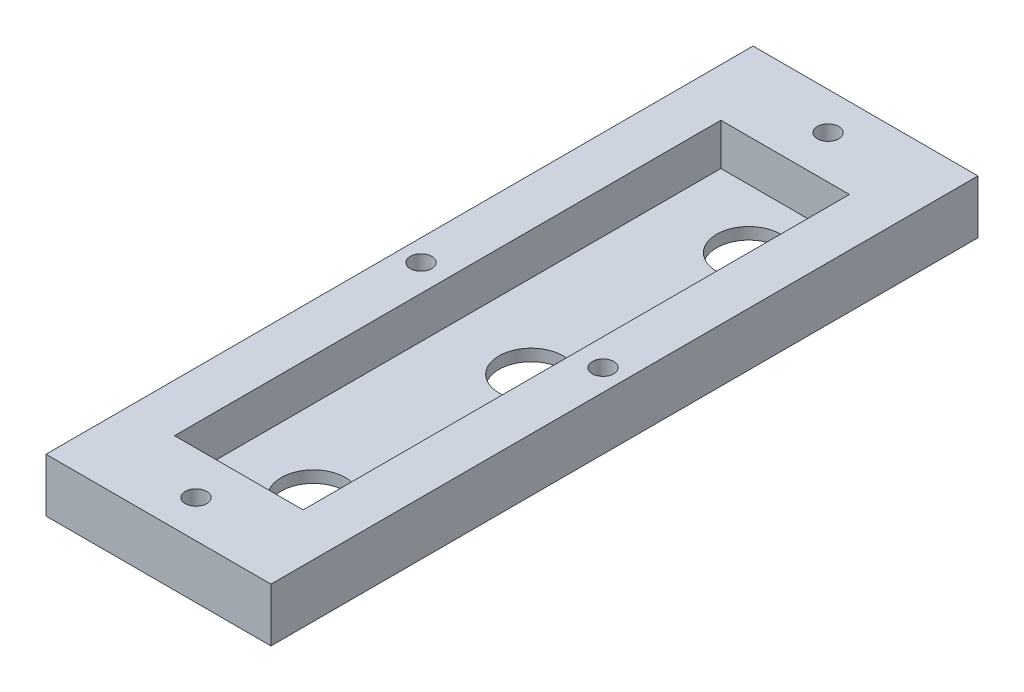
ISO-10303-21;
HEADER;
FILE_DESCRIPTION(('STEP AP214'),'2;1');
FILE_NAME('part.step','',(''),(''),'','','');
FILE_SCHEMA(('AUTOMOTIVE_DESIGN { 1 0 10303 214 1 1 1 1 }'));
ENDSEC;
DATA;
#1=APPLICATION_CONTEXT('core data for automotive mechanical design processes');
#2=APPLICATION_PROTOCOL_DEFINITION('international standard','automotive_design',2000,#1);
#3=PRODUCT_CONTEXT('',#1,'mechanical');
#4=PRODUCT('Part','Part','',(#3));
#5=PRODUCT_RELATED_PRODUCT_CATEGORY('part','',(#4));
#6=PRODUCT_DEFINITION_FORMATION('','',#4);
#7=PRODUCT_DEFINITION_CONTEXT('part definition',#1,'design');
#8=PRODUCT_DEFINITION('design','',#6,#7);
#9=PRODUCT_DEFINITION_SHAPE('','',#8);
#10=(LENGTH_UNIT() NAMED_UNIT(*) SI_UNIT(.MILLI.,.METRE.));
#11=(NAMED_UNIT(*) PLANE_ANGLE_UNIT() SI_UNIT($,.RADIAN.));
#12=(NAMED_UNIT(*) SI_UNIT($,.STERADIAN.) SOLID_ANGLE_UNIT());
#13=UNCERTAINTY_MEASURE_WITH_UNIT(LENGTH_MEASURE(1.E-05),#10,'distance_accuracy_value','');
#14=(GEOMETRIC_REPRESENTATION_CONTEXT(3) GLOBAL_UNCERTAINTY_ASSIGNED_CONTEXT((#13)) GLOBAL_UNIT_ASSIGNED_CONTEXT((#10,
#11,#12)) REPRESENTATION_CONTEXT('',''));
#15=CARTESIAN_POINT('',(0.,0.,0.));
#16=DIRECTION('',(0.,0.,1.));
#17=DIRECTION('',(1.,0.,0.));
#18=AXIS2_PLACEMENT_3D('',#15,#16,#17);
#19=CARTESIAN_POINT('',(0.,1.1,0.));
#20=DIRECTION('',(0.,-1.,0.));
#21=DIRECTION('',(0.,0.,-1.));
#22=AXIS2_PLACEMENT_3D('',#19,#20,#21);
#23=PLANE('',#22);
#24=CARTESIAN_POINT('',(2.11381085387861,1.1,-19.9912830124895));
#25=DIRECTION('',(0.,-1.,0.));
#26=DIRECTION('',(0.,0.,-1.));
#27=AXIS2_PLACEMENT_3D('',#24,#25,#26);
#28=CIRCLE('',#27,3.);
#29=CARTESIAN_POINT('',(2.11381085387861,1.1,-22.9912830124895));
#30=VERTEX_POINT('',#29);
#31=EDGE_CURVE('E168',#30,#30,#28,.T.);
#32=ORIENTED_EDGE('',*,*,#31,.T.);
#33=EDGE_LOOP('',(#32));
#34=FACE_BOUND('',#33,.T.);
#35=CARTESIAN_POINT('',(1.78606829592522,1.1,0.00603142759754427));
#36=DIRECTION('',(0.,-1.,0.));
#37=DIRECTION('',(0.,0.,-1.));
#38=AXIS2_PLACEMENT_3D('',#35,#36,#37);
#39=CIRCLE('',#38,3.);
#40=CARTESIAN_POINT('',(1.78606829592522,1.1,-2.99396857240246));
#41=VERTEX_POINT('',#40);
#42=EDGE_CURVE('E179',#41,#41,#39,.T.);
#43=ORIENTED_EDGE('',*,*,#42,.T.);
#44=EDGE_LOOP('',(#43));
#45=FACE_BOUND('',#44,.T.);
#46=CARTESIAN_POINT('',(1.45832573797182,1.1,20.0033458676846));
#47=DIRECTION('',(0.,-1.,0.));
#48=DIRECTION('',(0.,0.,-1.));
#49=AXIS2_PLACEMENT_3D('',#46,#47,#48);
#50=CIRCLE('',#49,3.);
#51=CARTESIAN_POINT('',(1.45832573797182,1.1,17.0033458676846));
#52=VERTEX_POINT('',#51);
#53=EDGE_CURVE('E169',#52,#52,#50,.T.);
#54=ORIENTED_EDGE('',*,*,#53,.T.);
#55=EDGE_LOOP('',(#54));
#56=FACE_BOUND('',#55,.T.);
#57=DIRECTION('',(1.,0.,0.));
#58=VECTOR('',#57,1.);
#59=CARTESIAN_POINT('',(0.,1.1,-25.5));
#60=LINE('',#59,#58);
#61=CARTESIAN_POINT('',(-6.00000000000001,1.1,-25.5));
#62=VERTEX_POINT('',#61);
#63=CARTESIAN_POINT('',(6.,1.1,-25.5));
#64=VERTEX_POINT('',#63);
#65=EDGE_CURVE('E58',#62,#64,#60,.T.);
#66=ORIENTED_EDGE('',*,*,#65,.F.);
#67=DIRECTION('',(0.,0.,1.));
#68=VECTOR('',#67,1.);
#69=CARTESIAN_POINT('',(-6.00000000000001,1.1,0.));
#70=LINE('',#69,#68);
#71=CARTESIAN_POINT('',(-6.00000000000001,1.1,25.5));
#72=VERTEX_POINT('',#71);
#73=EDGE_CURVE('E63',#62,#72,#70,.T.);
#74=ORIENTED_EDGE('',*,*,#73,.T.);
#75=DIRECTION('',(1.,0.,0.));
#76=VECTOR('',#75,1.);
#77=CARTESIAN_POINT('',(0.,1.1,25.5));
#78=LINE('',#77,#76);
#79=CARTESIAN_POINT('',(6.,1.1,25.5));
#80=VERTEX_POINT('',#79);
#81=EDGE_CURVE('E133',#72,#80,#78,.T.);
#82=ORIENTED_EDGE('',*,*,#81,.T.);
#83=DIRECTION('',(0.,0.,1.));
#84=VECTOR('',#83,1.);
#85=CARTESIAN_POINT('',(6.,1.1,0.));
#86=LINE('',#85,#84);
#87=EDGE_CURVE('E154',#64,#80,#86,.T.);
#88=ORIENTED_EDGE('',*,*,#87,.F.);
#89=EDGE_LOOP('',(#66,#74,#82,#88));
#90=FACE_BOUND('',#89,.T.);
#91=ADVANCED_FACE('F43',(#34,#45,#56,#90),#23,.F.);
#92=CARTESIAN_POINT('',(10.5,1.1,33.));
#93=DIRECTION('',(-1.,0.,0.));
#94=DIRECTION('',(0.,0.,1.));
#95=AXIS2_PLACEMENT_3D('',#92,#93,#94);
#96=PLANE('',#95);
#97=DIRECTION('',(0.,0.,-1.));
#98=VECTOR('',#97,1.);
#99=CARTESIAN_POINT('',(10.5,0.,33.));
#100=LINE('',#99,#98);
#101=CARTESIAN_POINT('',(10.5,0.,33.));
#102=VERTEX_POINT('',#101);
#103=CARTESIAN_POINT('',(10.5,0.,-33.));
#104=VERTEX_POINT('',#103);
#105=EDGE_CURVE('E172',#102,#104,#100,.T.);
#106=ORIENTED_EDGE('',*,*,#105,.T.);
#107=DIRECTION('',(0.,-1.,0.));
#108=VECTOR('',#107,1.);
#109=CARTESIAN_POINT('',(10.5,1.1,-33.));
#110=LINE('',#109,#108);
#111=CARTESIAN_POINT('',(10.5,5.,-33.));
#112=VERTEX_POINT('',#111);
#113=EDGE_CURVE('E12',#112,#104,#110,.T.);
#114=ORIENTED_EDGE('',*,*,#113,.F.);
#115=DIRECTION('',(0.,0.,-1.));
#116=VECTOR('',#115,1.);
#117=CARTESIAN_POINT('',(10.5,5.,0.));
#118=LINE('',#117,#116);
#119=CARTESIAN_POINT('',(10.5,5.,33.));
#120=VERTEX_POINT('',#119);
#121=EDGE_CURVE('E121',#120,#112,#118,.T.);
#122=ORIENTED_EDGE('',*,*,#121,.F.);
#123=DIRECTION('',(0.,-1.,0.));
#124=VECTOR('',#123,1.);
#125=CARTESIAN_POINT('',(10.5,1.1,33.));
#126=LINE('',#125,#124);
#127=EDGE_CURVE('E107',#120,#102,#126,.T.);
#128=ORIENTED_EDGE('',*,*,#127,.T.);
#129=EDGE_LOOP('',(#106,#114,#122,#128));
#130=FACE_BOUND('',#129,.T.);
#131=ADVANCED_FACE('F45',(#130),#96,.F.);
#132=CARTESIAN_POINT('',(-10.5,1.1,-33.));
#133=DIRECTION('',(0.,0.,1.));
#134=DIRECTION('',(1.,0.,0.));
#135=AXIS2_PLACEMENT_3D('',#132,#133,#134);
#136=PLANE('',#135);
#137=DIRECTION('',(-1.,0.,0.));
#138=VECTOR('',#137,1.);
#139=CARTESIAN_POINT('',(-10.5,0.,-33.));
#140=LINE('',#139,#138);
#141=CARTESIAN_POINT('',(-10.5,0.,-33.));
#142=VERTEX_POINT('',#141);
#143=EDGE_CURVE('E188',#104,#142,#140,.T.);
#144=ORIENTED_EDGE('',*,*,#143,.T.);
#145=DIRECTION('',(0.,-1.,0.));
#146=VECTOR('',#145,1.);
#147=CARTESIAN_POINT('',(-10.5,1.1,-33.));
#148=LINE('',#147,#146);
#149=CARTESIAN_POINT('',(-10.5,5.,-33.));
#150=VERTEX_POINT('',#149);
#151=EDGE_CURVE('E51',#150,#142,#148,.T.);
#152=ORIENTED_EDGE('',*,*,#151,.F.);
#153=DIRECTION('',(-1.,0.,0.));
#154=VECTOR('',#153,1.);
#155=CARTESIAN_POINT('',(0.,5.,-33.));
#156=LINE('',#155,#154);
#157=EDGE_CURVE('E125',#112,#150,#156,.T.);
#158=ORIENTED_EDGE('',*,*,#157,.F.);
#159=ORIENTED_EDGE('',*,*,#113,.T.);
#160=EDGE_LOOP('',(#144,#152,#158,#159));
#161=FACE_BOUND('',#160,.T.);
#162=ADVANCED_FACE('F200',(#161),#136,.F.);
#163=CARTESIAN_POINT('',(-10.5,1.1,33.));
#164=DIRECTION('',(1.,0.,0.));
#165=DIRECTION('',(0.,0.,-1.));
#166=AXIS2_PLACEMENT_3D('',#163,#164,#165);
#167=PLANE('',#166);
#168=DIRECTION('',(0.,0.,1.));
#169=VECTOR('',#168,1.);
#170=CARTESIAN_POINT('',(-10.5,0.,33.));
#171=LINE('',#170,#169);
#172=CARTESIAN_POINT('',(-10.5,0.,33.));
#173=VERTEX_POINT('',#172);
#174=EDGE_CURVE('E190',#142,#173,#171,.T.);
#175=ORIENTED_EDGE('',*,*,#174,.T.);
#176=DIRECTION('',(0.,-1.,0.));
#177=VECTOR('',#176,1.);
#178=CARTESIAN_POINT('',(-10.5,1.1,33.));
#179=LINE('',#178,#177);
#180=CARTESIAN_POINT('',(-10.5,5.,33.));
#181=VERTEX_POINT('',#180);
#182=EDGE_CURVE('E118',#181,#173,#179,.T.);
#183=ORIENTED_EDGE('',*,*,#182,.F.);
#184=DIRECTION('',(0.,0.,1.));
#185=VECTOR('',#184,1.);
#186=CARTESIAN_POINT('',(-10.5,5.,0.));
#187=LINE('',#186,#185);
#188=EDGE_CURVE('E131',#150,#181,#187,.T.);
#189=ORIENTED_EDGE('',*,*,#188,.F.);
#190=ORIENTED_EDGE('',*,*,#151,.T.);
#191=EDGE_LOOP('',(#175,#183,#189,#190));
#192=FACE_BOUND('',#191,.T.);
#193=ADVANCED_FACE('F196',(#192),#167,.F.);
#194=CARTESIAN_POINT('',(-10.5,1.1,33.));
#195=DIRECTION('',(0.,0.,-1.));
#196=DIRECTION('',(-1.,0.,0.));
#197=AXIS2_PLACEMENT_3D('',#194,#195,#196);
#198=PLANE('',#197);
#199=DIRECTION('',(1.,0.,0.));
#200=VECTOR('',#199,1.);
#201=CARTESIAN_POINT('',(-10.5,0.,33.));
#202=LINE('',#201,#200);
#203=EDGE_CURVE('E114',#173,#102,#202,.T.);
#204=ORIENTED_EDGE('',*,*,#203,.T.);
#205=ORIENTED_EDGE('',*,*,#127,.F.);
#206=DIRECTION('',(1.,0.,0.));
#207=VECTOR('',#206,1.);
#208=CARTESIAN_POINT('',(0.,5.,33.));
#209=LINE('',#208,#207);
#210=EDGE_CURVE('E112',#181,#120,#209,.T.);
#211=ORIENTED_EDGE('',*,*,#210,.F.);
#212=ORIENTED_EDGE('',*,*,#182,.T.);
#213=EDGE_LOOP('',(#204,#205,#211,#212));
#214=FACE_BOUND('',#213,.T.);
#215=ADVANCED_FACE('F109',(#214),#198,.F.);
#216=CARTESIAN_POINT('',(0.,0.,0.));
#217=DIRECTION('',(0.,-1.,0.));
#218=DIRECTION('',(0.,0.,-1.));
#219=AXIS2_PLACEMENT_3D('',#216,#217,#218);
#220=PLANE('',#219);
#221=CARTESIAN_POINT('',(0.,0.,29.5));
#222=DIRECTION('',(0.,-1.,0.));
#223=DIRECTION('',(0.,0.,-1.));
#224=AXIS2_PLACEMENT_3D('',#221,#222,#223);
#225=CIRCLE('',#224,1.9);
#226=CARTESIAN_POINT('',(0.,0.,27.6));
#227=VERTEX_POINT('',#226);
#228=EDGE_CURVE('E155',#227,#227,#225,.T.);
#229=ORIENTED_EDGE('',*,*,#228,.F.);
#230=EDGE_LOOP('',(#229));
#231=FACE_BOUND('',#230,.T.);
#232=CARTESIAN_POINT('',(-8.50000000000001,0.,0.));
#233=DIRECTION('',(0.,-1.,0.));
#234=DIRECTION('',(0.,0.,-1.));
#235=AXIS2_PLACEMENT_3D('',#232,#233,#234);
#236=CIRCLE('',#235,1.9);
#237=CARTESIAN_POINT('',(-8.50000000000001,0.,-1.89999999999999));
#238=VERTEX_POINT('',#237);
#239=EDGE_CURVE('E551',#238,#238,#236,.T.);
#240=ORIENTED_EDGE('',*,*,#239,.F.);
#241=EDGE_LOOP('',(#240));
#242=FACE_BOUND('',#241,.T.);
#243=CARTESIAN_POINT('',(8.50000000000001,0.,0.));
#244=DIRECTION('',(0.,-1.,0.));
#245=DIRECTION('',(0.,0.,-1.));
#246=AXIS2_PLACEMENT_3D('',#243,#244,#245);
#247=CIRCLE('',#246,1.9);
#248=CARTESIAN_POINT('',(8.50000000000001,0.,-1.89999999999999));
#249=VERTEX_POINT('',#248);
#250=EDGE_CURVE('E557',#249,#249,#247,.T.);
#251=ORIENTED_EDGE('',*,*,#250,.F.);
#252=EDGE_LOOP('',(#251));
#253=FACE_BOUND('',#252,.T.);
#254=CARTESIAN_POINT('',(0.,0.,-29.5));
#255=DIRECTION('',(0.,-1.,0.));
#256=DIRECTION('',(0.,0.,-1.));
#257=AXIS2_PLACEMENT_3D('',#254,#255,#256);
#258=CIRCLE('',#257,1.9);
#259=CARTESIAN_POINT('',(0.,0.,-31.4));
#260=VERTEX_POINT('',#259);
#261=EDGE_CURVE('E136',#260,#260,#258,.T.);
#262=ORIENTED_EDGE('',*,*,#261,.F.);
#263=EDGE_LOOP('',(#262));
#264=FACE_BOUND('',#263,.T.);
#265=CARTESIAN_POINT('',(1.45832573797182,0.,20.0033458676846));
#266=DIRECTION('',(0.,-1.,0.));
#267=DIRECTION('',(0.,0.,-1.));
#268=AXIS2_PLACEMENT_3D('',#265,#266,#267);
#269=CIRCLE('',#268,3.);
#270=CARTESIAN_POINT('',(1.45832573797182,0.,17.0033458676846));
#271=VERTEX_POINT('',#270);
#272=EDGE_CURVE('E173',#271,#271,#269,.T.);
#273=ORIENTED_EDGE('',*,*,#272,.F.);
#274=EDGE_LOOP('',(#273));
#275=FACE_BOUND('',#274,.T.);
#276=CARTESIAN_POINT('',(1.78606829592522,0.,0.00603142759754427));
#277=DIRECTION('',(0.,-1.,0.));
#278=DIRECTION('',(0.,0.,-1.));
#279=AXIS2_PLACEMENT_3D('',#276,#277,#278);
#280=CIRCLE('',#279,3.);
#281=CARTESIAN_POINT('',(1.78606829592522,0.,-2.99396857240246));
#282=VERTEX_POINT('',#281);
#283=EDGE_CURVE('E176',#282,#282,#280,.T.);
#284=ORIENTED_EDGE('',*,*,#283,.F.);
#285=EDGE_LOOP('',(#284));
#286=FACE_BOUND('',#285,.T.);
#287=CARTESIAN_POINT('',(2.11381085387861,0.,-19.9912830124895));
#288=DIRECTION('',(0.,-1.,0.));
#289=DIRECTION('',(0.,0.,-1.));
#290=AXIS2_PLACEMENT_3D('',#287,#288,#289);
#291=CIRCLE('',#290,3.);
#292=CARTESIAN_POINT('',(2.11381085387861,0.,-22.9912830124895));
#293=VERTEX_POINT('',#292);
#294=EDGE_CURVE('E182',#293,#293,#291,.T.);
#295=ORIENTED_EDGE('',*,*,#294,.F.);
#296=EDGE_LOOP('',(#295));
#297=FACE_BOUND('',#296,.T.);
#298=ORIENTED_EDGE('',*,*,#105,.F.);
#299=ORIENTED_EDGE('',*,*,#203,.F.);
#300=ORIENTED_EDGE('',*,*,#174,.F.);
#301=ORIENTED_EDGE('',*,*,#143,.F.);
#302=EDGE_LOOP('',(#298,#299,#300,#301));
#303=FACE_BOUND('',#302,.T.);
#304=ADVANCED_FACE('F199',(#231,#242,#253,#264,#275,#286,#297,#303),#220,.T.);
#305=CARTESIAN_POINT('',(2.11381085387861,1.1,-19.9912830124895));
#306=DIRECTION('',(0.,-1.,0.));
#307=DIRECTION('',(0.,0.,-1.));
#308=AXIS2_PLACEMENT_3D('',#305,#306,#307);
#309=CYLINDRICAL_SURFACE('',#308,3.);
#310=ORIENTED_EDGE('',*,*,#31,.F.);
#311=EDGE_LOOP('',(#310));
#312=FACE_BOUND('',#311,.T.);
#313=ORIENTED_EDGE('',*,*,#294,.T.);
#314=EDGE_LOOP('',(#313));
#315=FACE_BOUND('',#314,.T.);
#316=ADVANCED_FACE('F217',(#312,#315),#309,.F.);
#317=CARTESIAN_POINT('',(1.78606829592522,1.1,0.00603142759754427));
#318=DIRECTION('',(0.,-1.,0.));
#319=DIRECTION('',(0.,0.,-1.));
#320=AXIS2_PLACEMENT_3D('',#317,#318,#319);
#321=CYLINDRICAL_SURFACE('',#320,3.);
#322=ORIENTED_EDGE('',*,*,#42,.F.);
#323=EDGE_LOOP('',(#322));
#324=FACE_BOUND('',#323,.T.);
#325=ORIENTED_EDGE('',*,*,#283,.T.);
#326=EDGE_LOOP('',(#325));
#327=FACE_BOUND('',#326,.T.);
#328=ADVANCED_FACE('F444',(#324,#327),#321,.F.);
#329=CARTESIAN_POINT('',(1.45832573797182,1.1,20.0033458676846));
#330=DIRECTION('',(0.,-1.,0.));
#331=DIRECTION('',(0.,0.,-1.));
#332=AXIS2_PLACEMENT_3D('',#329,#330,#331);
#333=CYLINDRICAL_SURFACE('',#332,3.);
#334=ORIENTED_EDGE('',*,*,#53,.F.);
#335=EDGE_LOOP('',(#334));
#336=FACE_BOUND('',#335,.T.);
#337=ORIENTED_EDGE('',*,*,#272,.T.);
#338=EDGE_LOOP('',(#337));
#339=FACE_BOUND('',#338,.T.);
#340=ADVANCED_FACE('F235',(#336,#339),#333,.F.);
#341=CARTESIAN_POINT('',(0.,5.,-25.5));
#342=DIRECTION('',(0.,0.,-1.));
#343=DIRECTION('',(-1.,0.,0.));
#344=AXIS2_PLACEMENT_3D('',#341,#342,#343);
#345=PLANE('',#344);
#346=ORIENTED_EDGE('',*,*,#65,.T.);
#347=DIRECTION('',(0.,-1.,0.));
#348=VECTOR('',#347,1.);
#349=CARTESIAN_POINT('',(6.,5.,-25.5));
#350=LINE('',#349,#348);
#351=CARTESIAN_POINT('',(6.,5.,-25.5));
#352=VERTEX_POINT('',#351);
#353=EDGE_CURVE('E165',#352,#64,#350,.T.);
#354=ORIENTED_EDGE('',*,*,#353,.F.);
#355=DIRECTION('',(1.,0.,0.));
#356=VECTOR('',#355,1.);
#357=CARTESIAN_POINT('',(0.,5.,-25.5));
#358=LINE('',#357,#356);
#359=CARTESIAN_POINT('',(-6.00000000000001,5.,-25.5));
#360=VERTEX_POINT('',#359);
#361=EDGE_CURVE('E141',#360,#352,#358,.T.);
#362=ORIENTED_EDGE('',*,*,#361,.F.);
#363=DIRECTION('',(0.,-1.,0.));
#364=VECTOR('',#363,1.);
#365=CARTESIAN_POINT('',(-6.00000000000001,5.,-25.5));
#366=LINE('',#365,#364);
#367=EDGE_CURVE('E152',#360,#62,#366,.T.);
#368=ORIENTED_EDGE('',*,*,#367,.T.);
#369=EDGE_LOOP('',(#346,#354,#362,#368));
#370=FACE_BOUND('',#369,.T.);
#371=ADVANCED_FACE('F231',(#370),#345,.F.);
#372=CARTESIAN_POINT('',(6.,5.,0.));
#373=DIRECTION('',(1.,0.,0.));
#374=DIRECTION('',(0.,0.,-1.));
#375=AXIS2_PLACEMENT_3D('',#372,#373,#374);
#376=PLANE('',#375);
#377=ORIENTED_EDGE('',*,*,#87,.T.);
#378=DIRECTION('',(0.,-1.,0.));
#379=VECTOR('',#378,1.);
#380=CARTESIAN_POINT('',(6.,5.,25.5));
#381=LINE('',#380,#379);
#382=CARTESIAN_POINT('',(6.,5.,25.5));
#383=VERTEX_POINT('',#382);
#384=EDGE_CURVE('E162',#383,#80,#381,.T.);
#385=ORIENTED_EDGE('',*,*,#384,.F.);
#386=DIRECTION('',(0.,0.,1.));
#387=VECTOR('',#386,1.);
#388=CARTESIAN_POINT('',(6.,5.,0.));
#389=LINE('',#388,#387);
#390=EDGE_CURVE('E144',#352,#383,#389,.T.);
#391=ORIENTED_EDGE('',*,*,#390,.F.);
#392=ORIENTED_EDGE('',*,*,#353,.T.);
#393=EDGE_LOOP('',(#377,#385,#391,#392));
#394=FACE_BOUND('',#393,.T.);
#395=ADVANCED_FACE('F234',(#394),#376,.F.);
#396=CARTESIAN_POINT('',(0.,5.,25.5));
#397=DIRECTION('',(0.,0.,-1.));
#398=DIRECTION('',(-1.,0.,0.));
#399=AXIS2_PLACEMENT_3D('',#396,#397,#398);
#400=PLANE('',#399);
#401=ORIENTED_EDGE('',*,*,#81,.F.);
#402=DIRECTION('',(0.,-1.,0.));
#403=VECTOR('',#402,1.);
#404=CARTESIAN_POINT('',(-6.00000000000001,5.,25.5));
#405=LINE('',#404,#403);
#406=CARTESIAN_POINT('',(-6.00000000000001,5.,25.5));
#407=VERTEX_POINT('',#406);
#408=EDGE_CURVE('E160',#407,#72,#405,.T.);
#409=ORIENTED_EDGE('',*,*,#408,.F.);
#410=DIRECTION('',(1.,0.,0.));
#411=VECTOR('',#410,1.);
#412=CARTESIAN_POINT('',(0.,5.,25.5));
#413=LINE('',#412,#411);
#414=EDGE_CURVE('E146',#407,#383,#413,.T.);
#415=ORIENTED_EDGE('',*,*,#414,.T.);
#416=ORIENTED_EDGE('',*,*,#384,.T.);
#417=EDGE_LOOP('',(#401,#409,#415,#416));
#418=FACE_BOUND('',#417,.T.);
#419=ADVANCED_FACE('F243',(#418),#400,.T.);
#420=CARTESIAN_POINT('',(-6.00000000000001,5.,0.));
#421=DIRECTION('',(1.,0.,0.));
#422=DIRECTION('',(0.,0.,-1.));
#423=AXIS2_PLACEMENT_3D('',#420,#421,#422);
#424=PLANE('',#423);
#425=ORIENTED_EDGE('',*,*,#73,.F.);
#426=ORIENTED_EDGE('',*,*,#367,.F.);
#427=DIRECTION('',(0.,0.,1.));
#428=VECTOR('',#427,1.);
#429=CARTESIAN_POINT('',(-6.00000000000001,5.,0.));
#430=LINE('',#429,#428);
#431=EDGE_CURVE('E149',#360,#407,#430,.T.);
#432=ORIENTED_EDGE('',*,*,#431,.T.);
#433=ORIENTED_EDGE('',*,*,#408,.T.);
#434=EDGE_LOOP('',(#425,#426,#432,#433));
#435=FACE_BOUND('',#434,.T.);
#436=ADVANCED_FACE('F251',(#435),#424,.T.);
#437=CARTESIAN_POINT('',(0.,5.,0.));
#438=DIRECTION('',(0.,1.,0.));
#439=DIRECTION('',(0.,0.,1.));
#440=AXIS2_PLACEMENT_3D('',#437,#438,#439);
#441=PLANE('',#440);
#442=CARTESIAN_POINT('',(-8.50000000000001,5.,0.));
#443=DIRECTION('',(0.,-1.,0.));
#444=DIRECTION('',(0.,0.,-1.));
#445=AXIS2_PLACEMENT_3D('',#442,#443,#444);
#446=CIRCLE('',#445,1.);
#447=CARTESIAN_POINT('',(-8.50000000000001,5.,-0.999999999999986));
#448=VERTEX_POINT('',#447);
#449=EDGE_CURVE('E581',#448,#448,#446,.T.);
#450=ORIENTED_EDGE('',*,*,#449,.T.);
#451=EDGE_LOOP('',(#450));
#452=FACE_BOUND('',#451,.T.);
#453=CARTESIAN_POINT('',(8.50000000000001,5.,0.));
#454=DIRECTION('',(0.,-1.,0.));
#455=DIRECTION('',(0.,0.,-1.));
#456=AXIS2_PLACEMENT_3D('',#453,#454,#455);
#457=CIRCLE('',#456,1.);
#458=CARTESIAN_POINT('',(8.50000000000001,5.,-0.999999999999993));
#459=VERTEX_POINT('',#458);
#460=EDGE_CURVE('E588',#459,#459,#457,.T.);
#461=ORIENTED_EDGE('',*,*,#460,.T.);
#462=EDGE_LOOP('',(#461));
#463=FACE_BOUND('',#462,.T.);
#464=CARTESIAN_POINT('',(0.,5.,29.5));
#465=DIRECTION('',(0.,-1.,0.));
#466=DIRECTION('',(0.,0.,-1.));
#467=AXIS2_PLACEMENT_3D('',#464,#465,#466);
#468=CIRCLE('',#467,1.);
#469=CARTESIAN_POINT('',(0.,5.,28.5));
#470=VERTEX_POINT('',#469);
#471=EDGE_CURVE('E585',#470,#470,#468,.T.);
#472=ORIENTED_EDGE('',*,*,#471,.T.);
#473=EDGE_LOOP('',(#472));
#474=FACE_BOUND('',#473,.T.);
#475=CARTESIAN_POINT('',(0.,5.,-29.5));
#476=DIRECTION('',(0.,-1.,0.));
#477=DIRECTION('',(0.,0.,-1.));
#478=AXIS2_PLACEMENT_3D('',#475,#476,#477);
#479=CIRCLE('',#478,1.);
#480=CARTESIAN_POINT('',(0.,5.,-30.5));
#481=VERTEX_POINT('',#480);
#482=EDGE_CURVE('E529',#481,#481,#479,.T.);
#483=ORIENTED_EDGE('',*,*,#482,.T.);
#484=EDGE_LOOP('',(#483));
#485=FACE_BOUND('',#484,.T.);
#486=ORIENTED_EDGE('',*,*,#210,.T.);
#487=ORIENTED_EDGE('',*,*,#121,.T.);
#488=ORIENTED_EDGE('',*,*,#157,.T.);
#489=ORIENTED_EDGE('',*,*,#188,.T.);
#490=EDGE_LOOP('',(#486,#487,#488,#489));
#491=FACE_BOUND('',#490,.T.);
#492=ORIENTED_EDGE('',*,*,#361,.T.);
#493=ORIENTED_EDGE('',*,*,#390,.T.);
#494=ORIENTED_EDGE('',*,*,#414,.F.);
#495=ORIENTED_EDGE('',*,*,#431,.F.);
#496=EDGE_LOOP('',(#492,#493,#494,#495));
#497=FACE_BOUND('',#496,.T.);
#498=ADVANCED_FACE('F128',(#452,#463,#474,#485,#491,#497),#441,.T.);
#499=CARTESIAN_POINT('',(0.,10.3740115370178,-29.5));
#500=DIRECTION('',(0.,-1.,0.));
#501=DIRECTION('',(0.,0.,-1.));
#502=AXIS2_PLACEMENT_3D('',#499,#500,#501);
#503=CYLINDRICAL_SURFACE('',#502,1.9);
#504=ORIENTED_EDGE('',*,*,#261,.T.);
#505=EDGE_LOOP('',(#504));
#506=FACE_BOUND('',#505,.T.);
#507=CARTESIAN_POINT('',(0.,3.,-29.5));
#508=DIRECTION('',(0.,1.,0.));
#509=DIRECTION('',(0.,0.,1.));
#510=AXIS2_PLACEMENT_3D('',#507,#508,#509);
#511=CIRCLE('',#510,1.9);
#512=CARTESIAN_POINT('',(0.,3.,-27.6));
#513=VERTEX_POINT('',#512);
#514=EDGE_CURVE('E537',#513,#513,#511,.F.);
#515=ORIENTED_EDGE('',*,*,#514,.F.);
#516=EDGE_LOOP('',(#515));
#517=FACE_BOUND('',#516,.T.);
#518=ADVANCED_FACE('F267',(#506,#517),#503,.F.);
#519=CARTESIAN_POINT('',(0.,3.,0.));
#520=DIRECTION('',(0.,1.,0.));
#521=DIRECTION('',(0.,0.,1.));
#522=AXIS2_PLACEMENT_3D('',#519,#520,#521);
#523=PLANE('',#522);
#524=ORIENTED_EDGE('',*,*,#514,.T.);
#525=EDGE_LOOP('',(#524));
#526=FACE_BOUND('',#525,.T.);
#527=CARTESIAN_POINT('',(0.,3.,-29.5));
#528=DIRECTION('',(0.,1.,0.));
#529=DIRECTION('',(0.,0.,1.));
#530=AXIS2_PLACEMENT_3D('',#527,#528,#529);
#531=CIRCLE('',#530,1.);
#532=CARTESIAN_POINT('',(0.,3.,-28.5));
#533=VERTEX_POINT('',#532);
#534=EDGE_CURVE('E532',#533,#533,#531,.T.);
#535=ORIENTED_EDGE('',*,*,#534,.T.);
#536=EDGE_LOOP('',(#535));
#537=FACE_BOUND('',#536,.T.);
#538=ADVANCED_FACE('F280',(#526,#537),#523,.F.);
#539=CARTESIAN_POINT('',(8.50000000000001,10.3740115370178,0.));
#540=DIRECTION('',(0.,-1.,0.));
#541=DIRECTION('',(0.,0.,-1.));
#542=AXIS2_PLACEMENT_3D('',#539,#540,#541);
#543=CYLINDRICAL_SURFACE('',#542,1.9);
#544=ORIENTED_EDGE('',*,*,#250,.T.);
#545=EDGE_LOOP('',(#544));
#546=FACE_BOUND('',#545,.T.);
#547=CARTESIAN_POINT('',(8.50000000000001,3.,0.));
#548=DIRECTION('',(0.,1.,0.));
#549=DIRECTION('',(0.,0.,1.));
#550=AXIS2_PLACEMENT_3D('',#547,#548,#549);
#551=CIRCLE('',#550,1.9);
#552=CARTESIAN_POINT('',(8.50000000000001,3.,1.90000000000001));
#553=VERTEX_POINT('',#552);
#554=EDGE_CURVE('E554',#553,#553,#551,.F.);
#555=ORIENTED_EDGE('',*,*,#554,.F.);
#556=EDGE_LOOP('',(#555));
#557=FACE_BOUND('',#556,.T.);
#558=ADVANCED_FACE('F287',(#546,#557),#543,.F.);
#559=CARTESIAN_POINT('',(0.,3.,0.));
#560=DIRECTION('',(0.,1.,0.));
#561=DIRECTION('',(0.,0.,1.));
#562=AXIS2_PLACEMENT_3D('',#559,#560,#561);
#563=PLANE('',#562);
#564=ORIENTED_EDGE('',*,*,#554,.T.);
#565=EDGE_LOOP('',(#564));
#566=FACE_BOUND('',#565,.T.);
#567=CARTESIAN_POINT('',(8.50000000000001,3.,0.));
#568=DIRECTION('',(0.,1.,0.));
#569=DIRECTION('',(0.,0.,1.));
#570=AXIS2_PLACEMENT_3D('',#567,#568,#569);
#571=CIRCLE('',#570,1.);
#572=CARTESIAN_POINT('',(8.50000000000001,3.,1.00000000000001));
#573=VERTEX_POINT('',#572);
#574=EDGE_CURVE('E534',#573,#573,#571,.T.);
#575=ORIENTED_EDGE('',*,*,#574,.T.);
#576=EDGE_LOOP('',(#575));
#577=FACE_BOUND('',#576,.T.);
#578=ADVANCED_FACE('F295',(#566,#577),#563,.F.);
#579=CARTESIAN_POINT('',(-8.50000000000001,10.3740115370178,0.));
#580=DIRECTION('',(0.,-1.,0.));
#581=DIRECTION('',(0.,0.,-1.));
#582=AXIS2_PLACEMENT_3D('',#579,#580,#581);
#583=CYLINDRICAL_SURFACE('',#582,1.9);
#584=ORIENTED_EDGE('',*,*,#239,.T.);
#585=EDGE_LOOP('',(#584));
#586=FACE_BOUND('',#585,.T.);
#587=CARTESIAN_POINT('',(-8.50000000000001,3.,0.));
#588=DIRECTION('',(0.,1.,0.));
#589=DIRECTION('',(0.,0.,1.));
#590=AXIS2_PLACEMENT_3D('',#587,#588,#589);
#591=CIRCLE('',#590,1.9);
#592=CARTESIAN_POINT('',(-8.50000000000001,3.,1.90000000000001));
#593=VERTEX_POINT('',#592);
#594=EDGE_CURVE('E548',#593,#593,#591,.F.);
#595=ORIENTED_EDGE('',*,*,#594,.F.);
#596=EDGE_LOOP('',(#595));
#597=FACE_BOUND('',#596,.T.);
#598=ADVANCED_FACE('F303',(#586,#597),#583,.F.);
#599=CARTESIAN_POINT('',(0.,3.,0.));
#600=DIRECTION('',(0.,1.,0.));
#601=DIRECTION('',(0.,0.,1.));
#602=AXIS2_PLACEMENT_3D('',#599,#600,#601);
#603=PLANE('',#602);
#604=ORIENTED_EDGE('',*,*,#594,.T.);
#605=EDGE_LOOP('',(#604));
#606=FACE_BOUND('',#605,.T.);
#607=CARTESIAN_POINT('',(-8.50000000000001,3.,0.));
#608=DIRECTION('',(0.,1.,0.));
#609=DIRECTION('',(0.,0.,1.));
#610=AXIS2_PLACEMENT_3D('',#607,#608,#609);
#611=CIRCLE('',#610,1.);
#612=CARTESIAN_POINT('',(-8.50000000000001,3.,1.00000000000001));
#613=VERTEX_POINT('',#612);
#614=EDGE_CURVE('E539',#613,#613,#611,.T.);
#615=ORIENTED_EDGE('',*,*,#614,.T.);
#616=EDGE_LOOP('',(#615));
#617=FACE_BOUND('',#616,.T.);
#618=ADVANCED_FACE('F311',(#606,#617),#603,.F.);
#619=CARTESIAN_POINT('',(0.,10.3740115370178,29.5));
#620=DIRECTION('',(0.,-1.,0.));
#621=DIRECTION('',(0.,0.,-1.));
#622=AXIS2_PLACEMENT_3D('',#619,#620,#621);
#623=CYLINDRICAL_SURFACE('',#622,1.9);
#624=ORIENTED_EDGE('',*,*,#228,.T.);
#625=EDGE_LOOP('',(#624));
#626=FACE_BOUND('',#625,.T.);
#627=CARTESIAN_POINT('',(0.,3.,29.5));
#628=DIRECTION('',(0.,1.,0.));
#629=DIRECTION('',(0.,0.,1.));
#630=AXIS2_PLACEMENT_3D('',#627,#628,#629);
#631=CIRCLE('',#630,1.9);
#632=CARTESIAN_POINT('',(0.,3.,31.4));
#633=VERTEX_POINT('',#632);
#634=EDGE_CURVE('E545',#633,#633,#631,.F.);
#635=ORIENTED_EDGE('',*,*,#634,.F.);
#636=EDGE_LOOP('',(#635));
#637=FACE_BOUND('',#636,.T.);
#638=ADVANCED_FACE('F319',(#626,#637),#623,.F.);
#639=CARTESIAN_POINT('',(0.,3.,0.));
#640=DIRECTION('',(0.,1.,0.));
#641=DIRECTION('',(0.,0.,1.));
#642=AXIS2_PLACEMENT_3D('',#639,#640,#641);
#643=PLANE('',#642);
#644=ORIENTED_EDGE('',*,*,#634,.T.);
#645=EDGE_LOOP('',(#644));
#646=FACE_BOUND('',#645,.T.);
#647=CARTESIAN_POINT('',(0.,3.,29.5));
#648=DIRECTION('',(0.,1.,0.));
#649=DIRECTION('',(0.,0.,1.));
#650=AXIS2_PLACEMENT_3D('',#647,#648,#649);
#651=CIRCLE('',#650,1.);
#652=CARTESIAN_POINT('',(0.,3.,30.5));
#653=VERTEX_POINT('',#652);
#654=EDGE_CURVE('E579',#653,#653,#651,.T.);
#655=ORIENTED_EDGE('',*,*,#654,.T.);
#656=EDGE_LOOP('',(#655));
#657=FACE_BOUND('',#656,.T.);
#658=ADVANCED_FACE('F327',(#646,#657),#643,.F.);
#659=CARTESIAN_POINT('',(0.,5.,29.5));
#660=DIRECTION('',(0.,-1.,0.));
#661=DIRECTION('',(0.,0.,-1.));
#662=AXIS2_PLACEMENT_3D('',#659,#660,#661);
#663=CYLINDRICAL_SURFACE('',#662,1.);
#664=ORIENTED_EDGE('',*,*,#471,.F.);
#665=EDGE_LOOP('',(#664));
#666=FACE_BOUND('',#665,.T.);
#667=ORIENTED_EDGE('',*,*,#654,.F.);
#668=EDGE_LOOP('',(#667));
#669=FACE_BOUND('',#668,.T.);
#670=ADVANCED_FACE('F334',(#666,#669),#663,.F.);
#671=CARTESIAN_POINT('',(-8.50000000000001,5.,0.));
#672=DIRECTION('',(0.,-1.,0.));
#673=DIRECTION('',(0.,0.,-1.));
#674=AXIS2_PLACEMENT_3D('',#671,#672,#673);
#675=CYLINDRICAL_SURFACE('',#674,1.);
#676=ORIENTED_EDGE('',*,*,#449,.F.);
#677=EDGE_LOOP('',(#676));
#678=FACE_BOUND('',#677,.T.);
#679=ORIENTED_EDGE('',*,*,#614,.F.);
#680=EDGE_LOOP('',(#679));
#681=FACE_BOUND('',#680,.T.);
#682=ADVANCED_FACE('F341',(#678,#681),#675,.F.);
#683=CARTESIAN_POINT('',(8.50000000000001,5.,0.));
#684=DIRECTION('',(0.,-1.,0.));
#685=DIRECTION('',(0.,0.,-1.));
#686=AXIS2_PLACEMENT_3D('',#683,#684,#685);
#687=CYLINDRICAL_SURFACE('',#686,1.);
#688=ORIENTED_EDGE('',*,*,#460,.F.);
#689=EDGE_LOOP('',(#688));
#690=FACE_BOUND('',#689,.T.);
#691=ORIENTED_EDGE('',*,*,#574,.F.);
#692=EDGE_LOOP('',(#691));
#693=FACE_BOUND('',#692,.T.);
#694=ADVANCED_FACE('F349',(#690,#693),#687,.F.);
#695=CARTESIAN_POINT('',(0.,5.,-29.5));
#696=DIRECTION('',(0.,-1.,0.));
#697=DIRECTION('',(0.,0.,-1.));
#698=AXIS2_PLACEMENT_3D('',#695,#696,#697);
#699=CYLINDRICAL_SURFACE('',#698,1.);
#700=ORIENTED_EDGE('',*,*,#482,.F.);
#701=EDGE_LOOP('',(#700));
#702=FACE_BOUND('',#701,.T.);
#703=ORIENTED_EDGE('',*,*,#534,.F.);
#704=EDGE_LOOP('',(#703));
#705=FACE_BOUND('',#704,.T.);
#706=ADVANCED_FACE('F357',(#702,#705),#699,.F.);
#707=CLOSED_SHELL('',(#91,#131,#162,#193,#215,#304,#316,#328,#340,#371,#395,#419,#436,#498,#518,
#538,#558,#578,#598,#618,#638,#658,#670,#682,#694,#706));
#708=MANIFOLD_SOLID_BREP('B2',#707);
#709=ADVANCED_BREP_SHAPE_REPRESENTATION('',(#18,#708),#14);
#710=SHAPE_DEFINITION_REPRESENTATION(#9,#709);
ENDSEC;
END-ISO-10303-21;
